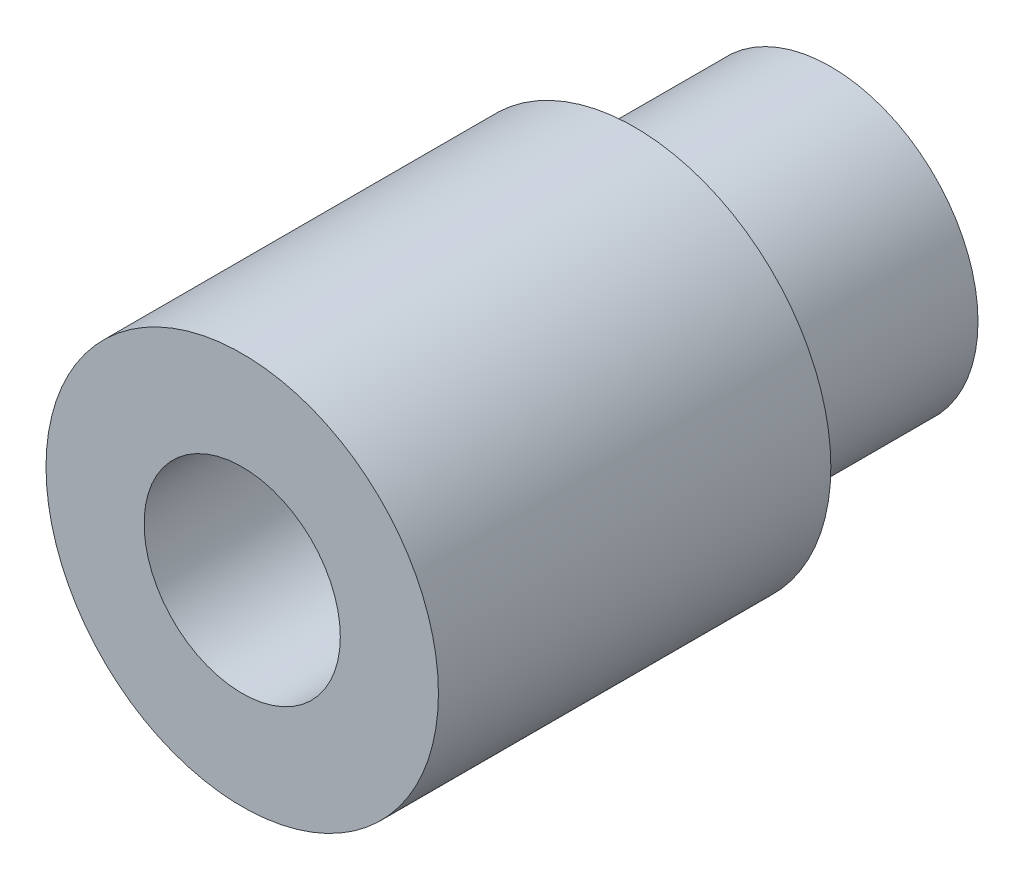
ISO-10303-21;
HEADER;
FILE_DESCRIPTION(('STEP AP214'),'2;1');
FILE_NAME('part.step','',(''),(''),'','','');
FILE_SCHEMA(('AUTOMOTIVE_DESIGN { 1 0 10303 214 1 1 1 1 }'));
ENDSEC;
DATA;
#1=APPLICATION_CONTEXT('core data for automotive mechanical design processes');
#2=APPLICATION_PROTOCOL_DEFINITION('international standard','automotive_design',2000,#1);
#3=PRODUCT_CONTEXT('',#1,'mechanical');
#4=PRODUCT('Part','Part','',(#3));
#5=PRODUCT_RELATED_PRODUCT_CATEGORY('part','',(#4));
#6=PRODUCT_DEFINITION_FORMATION('','',#4);
#7=PRODUCT_DEFINITION_CONTEXT('part definition',#1,'design');
#8=PRODUCT_DEFINITION('design','',#6,#7);
#9=PRODUCT_DEFINITION_SHAPE('','',#8);
#10=(LENGTH_UNIT() NAMED_UNIT(*) SI_UNIT(.MILLI.,.METRE.));
#11=(NAMED_UNIT(*) PLANE_ANGLE_UNIT() SI_UNIT($,.RADIAN.));
#12=(NAMED_UNIT(*) SI_UNIT($,.STERADIAN.) SOLID_ANGLE_UNIT());
#13=UNCERTAINTY_MEASURE_WITH_UNIT(LENGTH_MEASURE(1.E-05),#10,'distance_accuracy_value','');
#14=(GEOMETRIC_REPRESENTATION_CONTEXT(3) GLOBAL_UNCERTAINTY_ASSIGNED_CONTEXT((#13)) GLOBAL_UNIT_ASSIGNED_CONTEXT((#10,
#11,#12)) REPRESENTATION_CONTEXT('',''));
#15=CARTESIAN_POINT('',(0.,0.,0.));
#16=DIRECTION('',(0.,0.,1.));
#17=DIRECTION('',(1.,0.,0.));
#18=AXIS2_PLACEMENT_3D('',#15,#16,#17);
#19=CARTESIAN_POINT('',(0.,0.,0.));
#20=DIRECTION('',(0.,0.,1.));
#21=DIRECTION('',(1.,0.,0.));
#22=AXIS2_PLACEMENT_3D('',#19,#20,#21);
#23=PLANE('',#22);
#24=CARTESIAN_POINT('',(0.,0.,0.));
#25=DIRECTION('',(0.,0.,1.));
#26=DIRECTION('',(1.,0.,0.));
#27=AXIS2_PLACEMENT_3D('',#24,#25,#26);
#28=CIRCLE('',#27,3.);
#29=CARTESIAN_POINT('',(3.,0.,0.));
#30=VERTEX_POINT('',#29);
#31=EDGE_CURVE('E42',#30,#30,#28,.T.);
#32=ORIENTED_EDGE('',*,*,#31,.F.);
#33=EDGE_LOOP('',(#32));
#34=FACE_BOUND('',#33,.T.);
#35=CARTESIAN_POINT('',(0.,0.0504309359848576,0.));
#36=DIRECTION('',(0.,0.,1.));
#37=DIRECTION('',(1.,0.,0.));
#38=AXIS2_PLACEMENT_3D('',#35,#36,#37);
#39=CIRCLE('',#38,2.25);
#40=CARTESIAN_POINT('',(2.25,0.0504309359848576,0.));
#41=VERTEX_POINT('',#40);
#42=EDGE_CURVE('E10',#41,#41,#39,.F.);
#43=ORIENTED_EDGE('',*,*,#42,.F.);
#44=EDGE_LOOP('',(#43));
#45=FACE_BOUND('',#44,.T.);
#46=ADVANCED_FACE('F30',(#34,#45),#23,.F.);
#47=CARTESIAN_POINT('',(0.,0.,6.));
#48=DIRECTION('',(0.,0.,-1.));
#49=DIRECTION('',(-1.,0.,0.));
#50=AXIS2_PLACEMENT_3D('',#47,#48,#49);
#51=CYLINDRICAL_SURFACE('',#50,3.);
#52=CARTESIAN_POINT('',(0.,0.,6.));
#53=DIRECTION('',(0.,0.,1.));
#54=DIRECTION('',(1.,0.,0.));
#55=AXIS2_PLACEMENT_3D('',#52,#53,#54);
#56=CIRCLE('',#55,3.);
#57=CARTESIAN_POINT('',(3.,0.,6.));
#58=VERTEX_POINT('',#57);
#59=EDGE_CURVE('E38',#58,#58,#56,.T.);
#60=ORIENTED_EDGE('',*,*,#59,.F.);
#61=EDGE_LOOP('',(#60));
#62=FACE_BOUND('',#61,.T.);
#63=ORIENTED_EDGE('',*,*,#31,.T.);
#64=EDGE_LOOP('',(#63));
#65=FACE_BOUND('',#64,.T.);
#66=ADVANCED_FACE('F32',(#62,#65),#51,.T.);
#67=CARTESIAN_POINT('',(0.,0.,6.));
#68=DIRECTION('',(0.,0.,1.));
#69=DIRECTION('',(1.,0.,0.));
#70=AXIS2_PLACEMENT_3D('',#67,#68,#69);
#71=PLANE('',#70);
#72=CARTESIAN_POINT('',(0.,0.,6.));
#73=DIRECTION('',(0.,0.,1.));
#74=DIRECTION('',(1.,0.,0.));
#75=AXIS2_PLACEMENT_3D('',#72,#73,#74);
#76=CIRCLE('',#75,1.5);
#77=CARTESIAN_POINT('',(1.5,0.,6.));
#78=VERTEX_POINT('',#77);
#79=EDGE_CURVE('E50',#78,#78,#76,.T.);
#80=ORIENTED_EDGE('',*,*,#79,.F.);
#81=EDGE_LOOP('',(#80));
#82=FACE_BOUND('',#81,.T.);
#83=ORIENTED_EDGE('',*,*,#59,.T.);
#84=EDGE_LOOP('',(#83));
#85=FACE_BOUND('',#84,.T.);
#86=ADVANCED_FACE('F67',(#82,#85),#71,.T.);
#87=CARTESIAN_POINT('',(0.,0.0504309359848576,-3.));
#88=DIRECTION('',(0.,0.,1.));
#89=DIRECTION('',(1.,0.,0.));
#90=AXIS2_PLACEMENT_3D('',#87,#88,#89);
#91=CYLINDRICAL_SURFACE('',#90,2.25);
#92=CARTESIAN_POINT('',(0.,0.0504309359848576,-3.));
#93=DIRECTION('',(0.,0.,-1.));
#94=DIRECTION('',(-1.,0.,0.));
#95=AXIS2_PLACEMENT_3D('',#92,#93,#94);
#96=CIRCLE('',#95,2.25);
#97=CARTESIAN_POINT('',(-2.25,0.0504309359848576,-3.));
#98=VERTEX_POINT('',#97);
#99=EDGE_CURVE('E46',#98,#98,#96,.T.);
#100=ORIENTED_EDGE('',*,*,#99,.F.);
#101=EDGE_LOOP('',(#100));
#102=FACE_BOUND('',#101,.T.);
#103=ORIENTED_EDGE('',*,*,#42,.T.);
#104=EDGE_LOOP('',(#103));
#105=FACE_BOUND('',#104,.T.);
#106=ADVANCED_FACE('F62',(#102,#105),#91,.T.);
#107=CARTESIAN_POINT('',(0.,0.0504309359848576,-3.));
#108=DIRECTION('',(0.,0.,-1.));
#109=DIRECTION('',(-1.,0.,0.));
#110=AXIS2_PLACEMENT_3D('',#107,#108,#109);
#111=PLANE('',#110);
#112=CARTESIAN_POINT('',(0.,0.,-3.));
#113=DIRECTION('',(0.,0.,-1.));
#114=DIRECTION('',(-1.,0.,0.));
#115=AXIS2_PLACEMENT_3D('',#112,#113,#114);
#116=CIRCLE('',#115,1.5);
#117=CARTESIAN_POINT('',(-1.5,0.,-3.));
#118=VERTEX_POINT('',#117);
#119=EDGE_CURVE('E34',#118,#118,#116,.T.);
#120=ORIENTED_EDGE('',*,*,#119,.F.);
#121=EDGE_LOOP('',(#120));
#122=FACE_BOUND('',#121,.T.);
#123=ORIENTED_EDGE('',*,*,#99,.T.);
#124=EDGE_LOOP('',(#123));
#125=FACE_BOUND('',#124,.T.);
#126=ADVANCED_FACE('F59',(#122,#125),#111,.T.);
#127=CARTESIAN_POINT('',(0.,0.,-4.));
#128=DIRECTION('',(0.,0.,1.));
#129=DIRECTION('',(1.,0.,0.));
#130=AXIS2_PLACEMENT_3D('',#127,#128,#129);
#131=CYLINDRICAL_SURFACE('',#130,1.5);
#132=ORIENTED_EDGE('',*,*,#119,.T.);
#133=EDGE_LOOP('',(#132));
#134=FACE_BOUND('',#133,.T.);
#135=ORIENTED_EDGE('',*,*,#79,.T.);
#136=EDGE_LOOP('',(#135));
#137=FACE_BOUND('',#136,.T.);
#138=ADVANCED_FACE('F57',(#134,#137),#131,.F.);
#139=CLOSED_SHELL('',(#46,#66,#86,#106,#126,#138));
#140=MANIFOLD_SOLID_BREP('B2',#139);
#141=ADVANCED_BREP_SHAPE_REPRESENTATION('',(#18,#140),#14);
#142=SHAPE_DEFINITION_REPRESENTATION(#9,#141);
ENDSEC;
END-ISO-10303-21;
